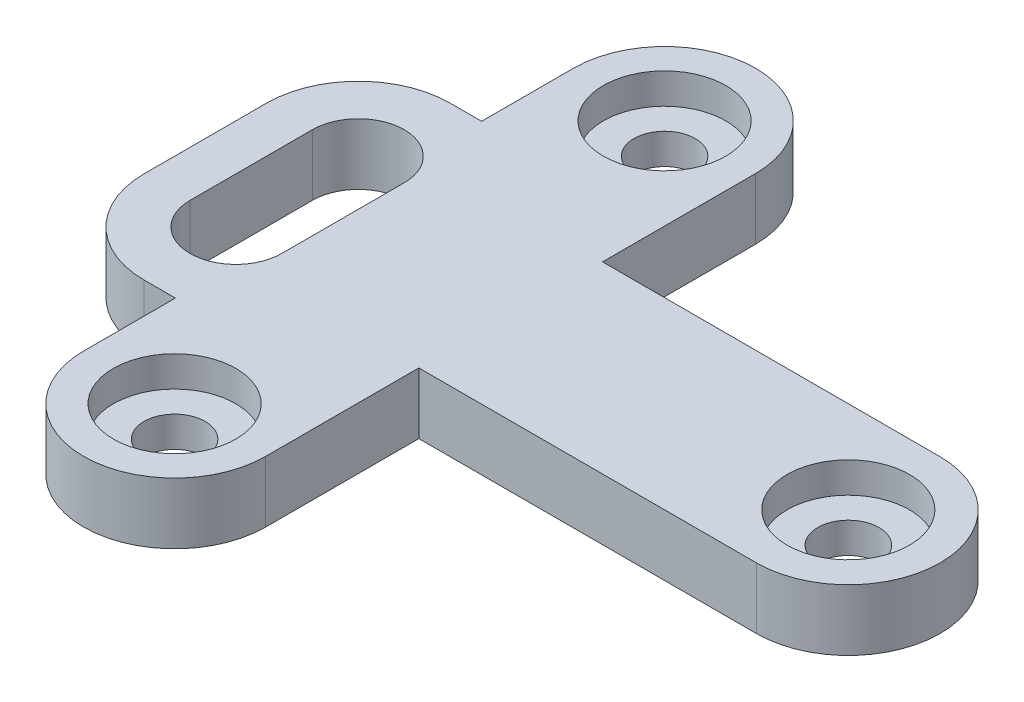
ISO-10303-21;
HEADER;
FILE_DESCRIPTION(('STEP AP214'),'2;1');
FILE_NAME('part.step','',(''),(''),'','','');
FILE_SCHEMA(('AUTOMOTIVE_DESIGN { 1 0 10303 214 1 1 1 1 }'));
ENDSEC;
DATA;
#1=APPLICATION_CONTEXT('core data for automotive mechanical design processes');
#2=APPLICATION_PROTOCOL_DEFINITION('international standard','automotive_design',2000,#1);
#3=PRODUCT_CONTEXT('',#1,'mechanical');
#4=PRODUCT('Part','Part','',(#3));
#5=PRODUCT_RELATED_PRODUCT_CATEGORY('part','',(#4));
#6=PRODUCT_DEFINITION_FORMATION('','',#4);
#7=PRODUCT_DEFINITION_CONTEXT('part definition',#1,'design');
#8=PRODUCT_DEFINITION('design','',#6,#7);
#9=PRODUCT_DEFINITION_SHAPE('','',#8);
#10=(LENGTH_UNIT() NAMED_UNIT(*) SI_UNIT(.MILLI.,.METRE.));
#11=(NAMED_UNIT(*) PLANE_ANGLE_UNIT() SI_UNIT($,.RADIAN.));
#12=(NAMED_UNIT(*) SI_UNIT($,.STERADIAN.) SOLID_ANGLE_UNIT());
#13=UNCERTAINTY_MEASURE_WITH_UNIT(LENGTH_MEASURE(1.E-05),#10,'distance_accuracy_value','');
#14=(GEOMETRIC_REPRESENTATION_CONTEXT(3) GLOBAL_UNCERTAINTY_ASSIGNED_CONTEXT((#13)) GLOBAL_UNIT_ASSIGNED_CONTEXT((#10,
#11,#12)) REPRESENTATION_CONTEXT('',''));
#15=CARTESIAN_POINT('',(0.,0.,0.));
#16=DIRECTION('',(0.,0.,1.));
#17=DIRECTION('',(1.,0.,0.));
#18=AXIS2_PLACEMENT_3D('',#15,#16,#17);
#19=CARTESIAN_POINT('',(0.,10.,-25.));
#20=DIRECTION('',(0.,0.,-1.));
#21=DIRECTION('',(-1.,0.,0.));
#22=AXIS2_PLACEMENT_3D('',#19,#20,#21);
#23=PLANE('',#22);
#24=DIRECTION('',(1.,0.,0.));
#25=VECTOR('',#24,1.);
#26=CARTESIAN_POINT('',(0.,0.,-25.));
#27=LINE('',#26,#25);
#28=CARTESIAN_POINT('',(-31.8487960876977,0.,-25.));
#29=VERTEX_POINT('',#28);
#30=CARTESIAN_POINT('',(-26.7239932822356,0.,-25.));
#31=VERTEX_POINT('',#30);
#32=EDGE_CURVE('E228',#29,#31,#27,.T.);
#33=ORIENTED_EDGE('',*,*,#32,.F.);
#34=DIRECTION('',(0.,-1.,0.));
#35=VECTOR('',#34,1.);
#36=CARTESIAN_POINT('',(-31.8487960876977,10.,-25.));
#37=LINE('',#36,#35);
#38=CARTESIAN_POINT('',(-31.8487960876977,10.,-25.));
#39=VERTEX_POINT('',#38);
#40=EDGE_CURVE('E317',#39,#29,#37,.T.);
#41=ORIENTED_EDGE('',*,*,#40,.F.);
#42=DIRECTION('',(1.,0.,0.));
#43=VECTOR('',#42,1.);
#44=CARTESIAN_POINT('',(0.,10.,-25.));
#45=LINE('',#44,#43);
#46=CARTESIAN_POINT('',(-26.7239932822356,10.,-25.));
#47=VERTEX_POINT('',#46);
#48=EDGE_CURVE('E368',#39,#47,#45,.T.);
#49=ORIENTED_EDGE('',*,*,#48,.T.);
#50=DIRECTION('',(0.,-1.,0.));
#51=VECTOR('',#50,1.);
#52=CARTESIAN_POINT('',(-26.7239932822356,10.,-25.));
#53=LINE('',#52,#51);
#54=EDGE_CURVE('E125',#47,#31,#53,.T.);
#55=ORIENTED_EDGE('',*,*,#54,.T.);
#56=EDGE_LOOP('',(#33,#41,#49,#55));
#57=FACE_BOUND('',#56,.T.);
#58=ADVANCED_FACE('F41',(#57),#23,.T.);
#59=CARTESIAN_POINT('',(-31.8487960876976,10.,-10.));
#60=DIRECTION('',(0.,-1.,0.));
#61=DIRECTION('',(0.,0.,-1.));
#62=AXIS2_PLACEMENT_3D('',#59,#60,#61);
#63=CYLINDRICAL_SURFACE('',#62,15.);
#64=CARTESIAN_POINT('',(-31.8487960876976,0.,-10.));
#65=DIRECTION('',(0.,1.,0.));
#66=DIRECTION('',(0.,0.,1.));
#67=AXIS2_PLACEMENT_3D('',#64,#65,#66);
#68=CIRCLE('',#67,15.);
#69=CARTESIAN_POINT('',(-46.8487960876976,0.,-10.));
#70=VERTEX_POINT('',#69);
#71=EDGE_CURVE('E231',#29,#70,#68,.T.);
#72=ORIENTED_EDGE('',*,*,#71,.T.);
#73=DIRECTION('',(0.,-1.,0.));
#74=VECTOR('',#73,1.);
#75=CARTESIAN_POINT('',(-46.8487960876976,10.,-10.));
#76=LINE('',#75,#74);
#77=CARTESIAN_POINT('',(-46.8487960876976,10.,-10.));
#78=VERTEX_POINT('',#77);
#79=EDGE_CURVE('E313',#78,#70,#76,.T.);
#80=ORIENTED_EDGE('',*,*,#79,.F.);
#81=CARTESIAN_POINT('',(-31.8487960876976,10.,-10.));
#82=DIRECTION('',(0.,1.,0.));
#83=DIRECTION('',(0.,0.,1.));
#84=AXIS2_PLACEMENT_3D('',#81,#82,#83);
#85=CIRCLE('',#84,15.);
#86=EDGE_CURVE('E371',#39,#78,#85,.T.);
#87=ORIENTED_EDGE('',*,*,#86,.F.);
#88=ORIENTED_EDGE('',*,*,#40,.T.);
#89=EDGE_LOOP('',(#72,#80,#87,#88));
#90=FACE_BOUND('',#89,.T.);
#91=ADVANCED_FACE('F464',(#90),#63,.T.);
#92=CARTESIAN_POINT('',(-46.8487960876976,10.,0.));
#93=DIRECTION('',(1.,0.,0.));
#94=DIRECTION('',(0.,0.,-1.));
#95=AXIS2_PLACEMENT_3D('',#92,#93,#94);
#96=PLANE('',#95);
#97=DIRECTION('',(0.,0.,1.));
#98=VECTOR('',#97,1.);
#99=CARTESIAN_POINT('',(-46.8487960876976,0.,0.));
#100=LINE('',#99,#98);
#101=CARTESIAN_POINT('',(-46.8487960876976,0.,10.));
#102=VERTEX_POINT('',#101);
#103=EDGE_CURVE('E235',#70,#102,#100,.T.);
#104=ORIENTED_EDGE('',*,*,#103,.T.);
#105=DIRECTION('',(0.,-1.,0.));
#106=VECTOR('',#105,1.);
#107=CARTESIAN_POINT('',(-46.8487960876976,10.,10.));
#108=LINE('',#107,#106);
#109=CARTESIAN_POINT('',(-46.8487960876976,10.,10.));
#110=VERTEX_POINT('',#109);
#111=EDGE_CURVE('E309',#110,#102,#108,.T.);
#112=ORIENTED_EDGE('',*,*,#111,.F.);
#113=DIRECTION('',(0.,0.,1.));
#114=VECTOR('',#113,1.);
#115=CARTESIAN_POINT('',(-46.8487960876976,10.,0.));
#116=LINE('',#115,#114);
#117=EDGE_CURVE('E375',#78,#110,#116,.T.);
#118=ORIENTED_EDGE('',*,*,#117,.F.);
#119=ORIENTED_EDGE('',*,*,#79,.T.);
#120=EDGE_LOOP('',(#104,#112,#118,#119));
#121=FACE_BOUND('',#120,.T.);
#122=ADVANCED_FACE('F469',(#121),#96,.F.);
#123=CARTESIAN_POINT('',(-31.8487960876976,10.,10.));
#124=DIRECTION('',(0.,-1.,0.));
#125=DIRECTION('',(0.,0.,-1.));
#126=AXIS2_PLACEMENT_3D('',#123,#124,#125);
#127=CYLINDRICAL_SURFACE('',#126,15.);
#128=CARTESIAN_POINT('',(-31.8487960876976,0.,10.));
#129=DIRECTION('',(0.,1.,0.));
#130=DIRECTION('',(0.,0.,1.));
#131=AXIS2_PLACEMENT_3D('',#128,#129,#130);
#132=CIRCLE('',#131,15.);
#133=CARTESIAN_POINT('',(-31.8487960876975,0.,25.));
#134=VERTEX_POINT('',#133);
#135=EDGE_CURVE('E239',#102,#134,#132,.T.);
#136=ORIENTED_EDGE('',*,*,#135,.T.);
#137=DIRECTION('',(0.,-1.,0.));
#138=VECTOR('',#137,1.);
#139=CARTESIAN_POINT('',(-31.8487960876975,10.,25.));
#140=LINE('',#139,#138);
#141=CARTESIAN_POINT('',(-31.8487960876975,10.,25.));
#142=VERTEX_POINT('',#141);
#143=EDGE_CURVE('E305',#142,#134,#140,.T.);
#144=ORIENTED_EDGE('',*,*,#143,.F.);
#145=CARTESIAN_POINT('',(-31.8487960876976,10.,10.));
#146=DIRECTION('',(0.,1.,0.));
#147=DIRECTION('',(0.,0.,1.));
#148=AXIS2_PLACEMENT_3D('',#145,#146,#147);
#149=CIRCLE('',#148,15.);
#150=EDGE_CURVE('E379',#110,#142,#149,.T.);
#151=ORIENTED_EDGE('',*,*,#150,.F.);
#152=ORIENTED_EDGE('',*,*,#111,.T.);
#153=EDGE_LOOP('',(#136,#144,#151,#152));
#154=FACE_BOUND('',#153,.T.);
#155=ADVANCED_FACE('F542',(#154),#127,.T.);
#156=CARTESIAN_POINT('',(0.,10.,25.));
#157=DIRECTION('',(0.,0.,-1.));
#158=DIRECTION('',(-1.,0.,0.));
#159=AXIS2_PLACEMENT_3D('',#156,#157,#158);
#160=PLANE('',#159);
#161=DIRECTION('',(1.,0.,0.));
#162=VECTOR('',#161,1.);
#163=CARTESIAN_POINT('',(0.,0.,25.));
#164=LINE('',#163,#162);
#165=CARTESIAN_POINT('',(-26.7239932822356,0.,25.));
#166=VERTEX_POINT('',#165);
#167=EDGE_CURVE('E243',#134,#166,#164,.T.);
#168=ORIENTED_EDGE('',*,*,#167,.T.);
#169=DIRECTION('',(0.,-1.,0.));
#170=VECTOR('',#169,1.);
#171=CARTESIAN_POINT('',(-26.7239932822356,10.,25.));
#172=LINE('',#171,#170);
#173=CARTESIAN_POINT('',(-26.7239932822356,10.,25.));
#174=VERTEX_POINT('',#173);
#175=EDGE_CURVE('E301',#174,#166,#172,.T.);
#176=ORIENTED_EDGE('',*,*,#175,.F.);
#177=DIRECTION('',(1.,0.,0.));
#178=VECTOR('',#177,1.);
#179=CARTESIAN_POINT('',(0.,10.,25.));
#180=LINE('',#179,#178);
#181=EDGE_CURVE('E383',#142,#174,#180,.T.);
#182=ORIENTED_EDGE('',*,*,#181,.F.);
#183=ORIENTED_EDGE('',*,*,#143,.T.);
#184=EDGE_LOOP('',(#168,#176,#182,#183));
#185=FACE_BOUND('',#184,.T.);
#186=ADVANCED_FACE('F538',(#185),#160,.F.);
#187=CARTESIAN_POINT('',(-26.7239932822356,10.,0.));
#188=DIRECTION('',(1.,0.,0.));
#189=DIRECTION('',(0.,0.,-1.));
#190=AXIS2_PLACEMENT_3D('',#187,#188,#189);
#191=PLANE('',#190);
#192=DIRECTION('',(0.,0.,1.));
#193=VECTOR('',#192,1.);
#194=CARTESIAN_POINT('',(-26.7239932822356,0.,0.));
#195=LINE('',#194,#193);
#196=CARTESIAN_POINT('',(-26.7239932822356,0.,40.));
#197=VERTEX_POINT('',#196);
#198=EDGE_CURVE('E247',#166,#197,#195,.T.);
#199=ORIENTED_EDGE('',*,*,#198,.T.);
#200=DIRECTION('',(0.,-1.,0.));
#201=VECTOR('',#200,1.);
#202=CARTESIAN_POINT('',(-26.7239932822356,10.,40.));
#203=LINE('',#202,#201);
#204=CARTESIAN_POINT('',(-26.7239932822356,10.,40.));
#205=VERTEX_POINT('',#204);
#206=EDGE_CURVE('E298',#205,#197,#203,.T.);
#207=ORIENTED_EDGE('',*,*,#206,.F.);
#208=DIRECTION('',(0.,0.,1.));
#209=VECTOR('',#208,1.);
#210=CARTESIAN_POINT('',(-26.7239932822356,10.,0.));
#211=LINE('',#210,#209);
#212=EDGE_CURVE('E387',#174,#205,#211,.T.);
#213=ORIENTED_EDGE('',*,*,#212,.F.);
#214=ORIENTED_EDGE('',*,*,#175,.T.);
#215=EDGE_LOOP('',(#199,#207,#213,#214));
#216=FACE_BOUND('',#215,.T.);
#217=ADVANCED_FACE('F534',(#216),#191,.F.);
#218=CARTESIAN_POINT('',(-11.8487960876976,10.,40.));
#219=DIRECTION('',(0.,-1.,0.));
#220=DIRECTION('',(0.,0.,-1.));
#221=AXIS2_PLACEMENT_3D('',#218,#219,#220);
#222=CYLINDRICAL_SURFACE('',#221,14.8751971945379);
#223=CARTESIAN_POINT('',(-11.8487960876976,0.,40.));
#224=DIRECTION('',(0.,1.,0.));
#225=DIRECTION('',(0.,0.,1.));
#226=AXIS2_PLACEMENT_3D('',#223,#224,#225);
#227=CIRCLE('',#226,14.8751971945379);
#228=CARTESIAN_POINT('',(3.0264011068403,0.,40.));
#229=VERTEX_POINT('',#228);
#230=EDGE_CURVE('E251',#229,#197,#227,.F.);
#231=ORIENTED_EDGE('',*,*,#230,.F.);
#232=DIRECTION('',(0.,-1.,0.));
#233=VECTOR('',#232,1.);
#234=CARTESIAN_POINT('',(3.0264011068403,10.,40.));
#235=LINE('',#234,#233);
#236=CARTESIAN_POINT('',(3.0264011068403,10.,40.));
#237=VERTEX_POINT('',#236);
#238=EDGE_CURVE('E295',#237,#229,#235,.T.);
#239=ORIENTED_EDGE('',*,*,#238,.F.);
#240=CARTESIAN_POINT('',(-11.8487960876976,10.,40.));
#241=DIRECTION('',(0.,1.,0.));
#242=DIRECTION('',(0.,0.,1.));
#243=AXIS2_PLACEMENT_3D('',#240,#241,#242);
#244=CIRCLE('',#243,14.8751971945379);
#245=EDGE_CURVE('E390',#237,#205,#244,.F.);
#246=ORIENTED_EDGE('',*,*,#245,.T.);
#247=ORIENTED_EDGE('',*,*,#206,.T.);
#248=EDGE_LOOP('',(#231,#239,#246,#247));
#249=FACE_BOUND('',#248,.T.);
#250=ADVANCED_FACE('F530',(#249),#222,.T.);
#251=CARTESIAN_POINT('',(3.0264011068403,10.,0.));
#252=DIRECTION('',(-1.,0.,0.));
#253=DIRECTION('',(0.,0.,1.));
#254=AXIS2_PLACEMENT_3D('',#251,#252,#253);
#255=PLANE('',#254);
#256=DIRECTION('',(0.,0.,-1.));
#257=VECTOR('',#256,1.);
#258=CARTESIAN_POINT('',(3.0264011068403,0.,0.));
#259=LINE('',#258,#257);
#260=CARTESIAN_POINT('',(3.0264011068403,0.,15.));
#261=VERTEX_POINT('',#260);
#262=EDGE_CURVE('E255',#229,#261,#259,.T.);
#263=ORIENTED_EDGE('',*,*,#262,.T.);
#264=DIRECTION('',(0.,-1.,0.));
#265=VECTOR('',#264,1.);
#266=CARTESIAN_POINT('',(3.0264011068403,10.,15.));
#267=LINE('',#266,#265);
#268=CARTESIAN_POINT('',(3.0264011068403,10.,15.));
#269=VERTEX_POINT('',#268);
#270=EDGE_CURVE('E292',#269,#261,#267,.T.);
#271=ORIENTED_EDGE('',*,*,#270,.F.);
#272=DIRECTION('',(0.,0.,-1.));
#273=VECTOR('',#272,1.);
#274=CARTESIAN_POINT('',(3.0264011068403,10.,0.));
#275=LINE('',#274,#273);
#276=EDGE_CURVE('E394',#237,#269,#275,.T.);
#277=ORIENTED_EDGE('',*,*,#276,.F.);
#278=ORIENTED_EDGE('',*,*,#238,.T.);
#279=EDGE_LOOP('',(#263,#271,#277,#278));
#280=FACE_BOUND('',#279,.T.);
#281=ADVANCED_FACE('F526',(#280),#255,.F.);
#282=CARTESIAN_POINT('',(0.,10.,15.));
#283=DIRECTION('',(0.,0.,1.));
#284=DIRECTION('',(1.,0.,0.));
#285=AXIS2_PLACEMENT_3D('',#282,#283,#284);
#286=PLANE('',#285);
#287=DIRECTION('',(-1.,0.,0.));
#288=VECTOR('',#287,1.);
#289=CARTESIAN_POINT('',(0.,0.,15.));
#290=LINE('',#289,#288);
#291=CARTESIAN_POINT('',(58.1512039123024,0.,15.));
#292=VERTEX_POINT('',#291);
#293=EDGE_CURVE('E259',#292,#261,#290,.T.);
#294=ORIENTED_EDGE('',*,*,#293,.F.);
#295=DIRECTION('',(0.,-1.,0.));
#296=VECTOR('',#295,1.);
#297=CARTESIAN_POINT('',(58.1512039123024,10.,15.));
#298=LINE('',#297,#296);
#299=CARTESIAN_POINT('',(58.1512039123024,10.,15.));
#300=VERTEX_POINT('',#299);
#301=EDGE_CURVE('E289',#300,#292,#298,.T.);
#302=ORIENTED_EDGE('',*,*,#301,.F.);
#303=DIRECTION('',(-1.,0.,0.));
#304=VECTOR('',#303,1.);
#305=CARTESIAN_POINT('',(0.,10.,15.));
#306=LINE('',#305,#304);
#307=EDGE_CURVE('E397',#300,#269,#306,.T.);
#308=ORIENTED_EDGE('',*,*,#307,.T.);
#309=ORIENTED_EDGE('',*,*,#270,.T.);
#310=EDGE_LOOP('',(#294,#302,#308,#309));
#311=FACE_BOUND('',#310,.T.);
#312=ADVANCED_FACE('F523',(#311),#286,.T.);
#313=CARTESIAN_POINT('',(58.1512039123024,10.,0.));
#314=DIRECTION('',(0.,-1.,0.));
#315=DIRECTION('',(0.,0.,-1.));
#316=AXIS2_PLACEMENT_3D('',#313,#314,#315);
#317=CYLINDRICAL_SURFACE('',#316,15.);
#318=CARTESIAN_POINT('',(58.1512039123024,0.,0.));
#319=DIRECTION('',(0.,1.,0.));
#320=DIRECTION('',(0.,0.,1.));
#321=AXIS2_PLACEMENT_3D('',#318,#319,#320);
#322=CIRCLE('',#321,15.);
#323=CARTESIAN_POINT('',(58.1512039123024,0.,-15.));
#324=VERTEX_POINT('',#323);
#325=EDGE_CURVE('E263',#292,#324,#322,.T.);
#326=ORIENTED_EDGE('',*,*,#325,.T.);
#327=DIRECTION('',(0.,-1.,0.));
#328=VECTOR('',#327,1.);
#329=CARTESIAN_POINT('',(58.1512039123024,10.,-15.));
#330=LINE('',#329,#328);
#331=CARTESIAN_POINT('',(58.1512039123024,10.,-15.));
#332=VERTEX_POINT('',#331);
#333=EDGE_CURVE('E285',#332,#324,#330,.T.);
#334=ORIENTED_EDGE('',*,*,#333,.F.);
#335=CARTESIAN_POINT('',(58.1512039123024,10.,0.));
#336=DIRECTION('',(0.,1.,0.));
#337=DIRECTION('',(0.,0.,1.));
#338=AXIS2_PLACEMENT_3D('',#335,#336,#337);
#339=CIRCLE('',#338,15.);
#340=EDGE_CURVE('E204',#300,#332,#339,.T.);
#341=ORIENTED_EDGE('',*,*,#340,.F.);
#342=ORIENTED_EDGE('',*,*,#301,.T.);
#343=EDGE_LOOP('',(#326,#334,#341,#342));
#344=FACE_BOUND('',#343,.T.);
#345=ADVANCED_FACE('F405',(#344),#317,.T.);
#346=CARTESIAN_POINT('',(0.,10.,-15.));
#347=DIRECTION('',(0.,0.,1.));
#348=DIRECTION('',(1.,0.,0.));
#349=AXIS2_PLACEMENT_3D('',#346,#347,#348);
#350=PLANE('',#349);
#351=DIRECTION('',(-1.,0.,0.));
#352=VECTOR('',#351,1.);
#353=CARTESIAN_POINT('',(0.,0.,-15.));
#354=LINE('',#353,#352);
#355=CARTESIAN_POINT('',(3.0264011068403,0.,-15.));
#356=VERTEX_POINT('',#355);
#357=EDGE_CURVE('E267',#324,#356,#354,.T.);
#358=ORIENTED_EDGE('',*,*,#357,.T.);
#359=DIRECTION('',(0.,-1.,0.));
#360=VECTOR('',#359,1.);
#361=CARTESIAN_POINT('',(3.0264011068403,10.,-15.));
#362=LINE('',#361,#360);
#363=CARTESIAN_POINT('',(3.0264011068403,10.,-15.));
#364=VERTEX_POINT('',#363);
#365=EDGE_CURVE('E189',#364,#356,#362,.T.);
#366=ORIENTED_EDGE('',*,*,#365,.F.);
#367=DIRECTION('',(-1.,0.,0.));
#368=VECTOR('',#367,1.);
#369=CARTESIAN_POINT('',(0.,10.,-15.));
#370=LINE('',#369,#368);
#371=EDGE_CURVE('E199',#332,#364,#370,.T.);
#372=ORIENTED_EDGE('',*,*,#371,.F.);
#373=ORIENTED_EDGE('',*,*,#333,.T.);
#374=EDGE_LOOP('',(#358,#366,#372,#373));
#375=FACE_BOUND('',#374,.T.);
#376=ADVANCED_FACE('F408',(#375),#350,.F.);
#377=CARTESIAN_POINT('',(3.0264011068403,10.,0.));
#378=DIRECTION('',(1.,0.,0.));
#379=DIRECTION('',(0.,0.,-1.));
#380=AXIS2_PLACEMENT_3D('',#377,#378,#379);
#381=PLANE('',#380);
#382=DIRECTION('',(0.,0.,1.));
#383=VECTOR('',#382,1.);
#384=CARTESIAN_POINT('',(3.0264011068403,0.,0.));
#385=LINE('',#384,#383);
#386=CARTESIAN_POINT('',(3.0264011068403,0.,-40.));
#387=VERTEX_POINT('',#386);
#388=EDGE_CURVE('E185',#387,#356,#385,.T.);
#389=ORIENTED_EDGE('',*,*,#388,.F.);
#390=DIRECTION('',(0.,-1.,0.));
#391=VECTOR('',#390,1.);
#392=CARTESIAN_POINT('',(3.0264011068403,10.,-40.));
#393=LINE('',#392,#391);
#394=CARTESIAN_POINT('',(3.0264011068403,10.,-40.));
#395=VERTEX_POINT('',#394);
#396=EDGE_CURVE('E179',#395,#387,#393,.T.);
#397=ORIENTED_EDGE('',*,*,#396,.F.);
#398=DIRECTION('',(0.,0.,1.));
#399=VECTOR('',#398,1.);
#400=CARTESIAN_POINT('',(3.0264011068403,10.,0.));
#401=LINE('',#400,#399);
#402=EDGE_CURVE('E183',#395,#364,#401,.T.);
#403=ORIENTED_EDGE('',*,*,#402,.T.);
#404=ORIENTED_EDGE('',*,*,#365,.T.);
#405=EDGE_LOOP('',(#389,#397,#403,#404));
#406=FACE_BOUND('',#405,.T.);
#407=ADVANCED_FACE('F181',(#406),#381,.T.);
#408=CARTESIAN_POINT('',(-11.8487960876976,10.,-40.));
#409=DIRECTION('',(0.,-1.,0.));
#410=DIRECTION('',(0.,0.,-1.));
#411=AXIS2_PLACEMENT_3D('',#408,#409,#410);
#412=CYLINDRICAL_SURFACE('',#411,14.8751971945379);
#413=CARTESIAN_POINT('',(-11.8487960876976,0.,-40.));
#414=DIRECTION('',(0.,1.,0.));
#415=DIRECTION('',(0.,0.,1.));
#416=AXIS2_PLACEMENT_3D('',#413,#414,#415);
#417=CIRCLE('',#416,14.8751971945379);
#418=CARTESIAN_POINT('',(-26.7239932822356,0.,-40.));
#419=VERTEX_POINT('',#418);
#420=EDGE_CURVE('E273',#387,#419,#417,.T.);
#421=ORIENTED_EDGE('',*,*,#420,.T.);
#422=DIRECTION('',(0.,-1.,0.));
#423=VECTOR('',#422,1.);
#424=CARTESIAN_POINT('',(-26.7239932822356,10.,-40.));
#425=LINE('',#424,#423);
#426=CARTESIAN_POINT('',(-26.7239932822356,10.,-40.));
#427=VERTEX_POINT('',#426);
#428=EDGE_CURVE('E190',#427,#419,#425,.T.);
#429=ORIENTED_EDGE('',*,*,#428,.F.);
#430=CARTESIAN_POINT('',(-11.8487960876976,10.,-40.));
#431=DIRECTION('',(0.,1.,0.));
#432=DIRECTION('',(0.,0.,1.));
#433=AXIS2_PLACEMENT_3D('',#430,#431,#432);
#434=CIRCLE('',#433,14.8751971945379);
#435=EDGE_CURVE('E193',#395,#427,#434,.T.);
#436=ORIENTED_EDGE('',*,*,#435,.F.);
#437=ORIENTED_EDGE('',*,*,#396,.T.);
#438=EDGE_LOOP('',(#421,#429,#436,#437));
#439=FACE_BOUND('',#438,.T.);
#440=ADVANCED_FACE('F194',(#439),#412,.T.);
#441=CARTESIAN_POINT('',(-31.8487960876976,10.,10.));
#442=DIRECTION('',(0.,-1.,0.));
#443=DIRECTION('',(0.,0.,-1.));
#444=AXIS2_PLACEMENT_3D('',#441,#442,#443);
#445=CYLINDRICAL_SURFACE('',#444,7.5);
#446=CARTESIAN_POINT('',(-31.8487960876976,0.,10.));
#447=DIRECTION('',(0.,1.,0.));
#448=DIRECTION('',(0.,0.,1.));
#449=AXIS2_PLACEMENT_3D('',#446,#447,#448);
#450=CIRCLE('',#449,7.5);
#451=CARTESIAN_POINT('',(-39.3487960876976,0.,10.));
#452=VERTEX_POINT('',#451);
#453=CARTESIAN_POINT('',(-24.3487960876976,0.,10.));
#454=VERTEX_POINT('',#453);
#455=EDGE_CURVE('E211',#452,#454,#450,.T.);
#456=ORIENTED_EDGE('',*,*,#455,.F.);
#457=DIRECTION('',(0.,-1.,0.));
#458=VECTOR('',#457,1.);
#459=CARTESIAN_POINT('',(-39.3487960876976,10.,10.));
#460=LINE('',#459,#458);
#461=CARTESIAN_POINT('',(-39.3487960876976,10.,10.));
#462=VERTEX_POINT('',#461);
#463=EDGE_CURVE('E132',#462,#452,#460,.T.);
#464=ORIENTED_EDGE('',*,*,#463,.F.);
#465=CARTESIAN_POINT('',(-31.8487960876976,10.,10.));
#466=DIRECTION('',(0.,1.,0.));
#467=DIRECTION('',(0.,0.,1.));
#468=AXIS2_PLACEMENT_3D('',#465,#466,#467);
#469=CIRCLE('',#468,7.5);
#470=CARTESIAN_POINT('',(-24.3487960876976,10.,10.));
#471=VERTEX_POINT('',#470);
#472=EDGE_CURVE('E349',#462,#471,#469,.T.);
#473=ORIENTED_EDGE('',*,*,#472,.T.);
#474=DIRECTION('',(0.,-1.,0.));
#475=VECTOR('',#474,1.);
#476=CARTESIAN_POINT('',(-24.3487960876976,10.,10.));
#477=LINE('',#476,#475);
#478=EDGE_CURVE('E210',#471,#454,#477,.T.);
#479=ORIENTED_EDGE('',*,*,#478,.T.);
#480=EDGE_LOOP('',(#456,#464,#473,#479));
#481=FACE_BOUND('',#480,.T.);
#482=ADVANCED_FACE('F485',(#481),#445,.F.);
#483=CARTESIAN_POINT('',(-39.3487960876976,10.,0.));
#484=DIRECTION('',(1.,0.,0.));
#485=DIRECTION('',(0.,0.,-1.));
#486=AXIS2_PLACEMENT_3D('',#483,#484,#485);
#487=PLANE('',#486);
#488=DIRECTION('',(0.,0.,1.));
#489=VECTOR('',#488,1.);
#490=CARTESIAN_POINT('',(-39.3487960876976,0.,0.));
#491=LINE('',#490,#489);
#492=CARTESIAN_POINT('',(-39.3487960876976,0.,-10.));
#493=VERTEX_POINT('',#492);
#494=EDGE_CURVE('E215',#493,#452,#491,.T.);
#495=ORIENTED_EDGE('',*,*,#494,.F.);
#496=DIRECTION('',(0.,-1.,0.));
#497=VECTOR('',#496,1.);
#498=CARTESIAN_POINT('',(-39.3487960876976,10.,-10.));
#499=LINE('',#498,#497);
#500=CARTESIAN_POINT('',(-39.3487960876976,10.,-10.));
#501=VERTEX_POINT('',#500);
#502=EDGE_CURVE('E325',#501,#493,#499,.T.);
#503=ORIENTED_EDGE('',*,*,#502,.F.);
#504=DIRECTION('',(0.,0.,1.));
#505=VECTOR('',#504,1.);
#506=CARTESIAN_POINT('',(-39.3487960876976,10.,0.));
#507=LINE('',#506,#505);
#508=EDGE_CURVE('E357',#501,#462,#507,.T.);
#509=ORIENTED_EDGE('',*,*,#508,.T.);
#510=ORIENTED_EDGE('',*,*,#463,.T.);
#511=EDGE_LOOP('',(#495,#503,#509,#510));
#512=FACE_BOUND('',#511,.T.);
#513=ADVANCED_FACE('F481',(#512),#487,.T.);
#514=CARTESIAN_POINT('',(-31.8487960876976,10.,-10.));
#515=DIRECTION('',(0.,-1.,0.));
#516=DIRECTION('',(0.,0.,-1.));
#517=AXIS2_PLACEMENT_3D('',#514,#515,#516);
#518=CYLINDRICAL_SURFACE('',#517,7.5);
#519=CARTESIAN_POINT('',(-31.8487960876976,0.,-10.));
#520=DIRECTION('',(0.,1.,0.));
#521=DIRECTION('',(0.,0.,1.));
#522=AXIS2_PLACEMENT_3D('',#519,#520,#521);
#523=CIRCLE('',#522,7.5);
#524=CARTESIAN_POINT('',(-24.3487960876976,0.,-10.));
#525=VERTEX_POINT('',#524);
#526=EDGE_CURVE('E220',#525,#493,#523,.T.);
#527=ORIENTED_EDGE('',*,*,#526,.F.);
#528=DIRECTION('',(0.,-1.,0.));
#529=VECTOR('',#528,1.);
#530=CARTESIAN_POINT('',(-24.3487960876976,10.,-10.));
#531=LINE('',#530,#529);
#532=CARTESIAN_POINT('',(-24.3487960876976,10.,-10.));
#533=VERTEX_POINT('',#532);
#534=EDGE_CURVE('E322',#533,#525,#531,.T.);
#535=ORIENTED_EDGE('',*,*,#534,.F.);
#536=CARTESIAN_POINT('',(-31.8487960876976,10.,-10.));
#537=DIRECTION('',(0.,1.,0.));
#538=DIRECTION('',(0.,0.,1.));
#539=AXIS2_PLACEMENT_3D('',#536,#537,#538);
#540=CIRCLE('',#539,7.5);
#541=EDGE_CURVE('E361',#533,#501,#540,.T.);
#542=ORIENTED_EDGE('',*,*,#541,.T.);
#543=ORIENTED_EDGE('',*,*,#502,.T.);
#544=EDGE_LOOP('',(#527,#535,#542,#543));
#545=FACE_BOUND('',#544,.T.);
#546=ADVANCED_FACE('F477',(#545),#518,.F.);
#547=CARTESIAN_POINT('',(-24.3487960876976,10.,0.));
#548=DIRECTION('',(1.,0.,0.));
#549=DIRECTION('',(0.,0.,-1.));
#550=AXIS2_PLACEMENT_3D('',#547,#548,#549);
#551=PLANE('',#550);
#552=DIRECTION('',(0.,0.,1.));
#553=VECTOR('',#552,1.);
#554=CARTESIAN_POINT('',(-24.3487960876976,0.,0.));
#555=LINE('',#554,#553);
#556=EDGE_CURVE('E224',#525,#454,#555,.T.);
#557=ORIENTED_EDGE('',*,*,#556,.T.);
#558=ORIENTED_EDGE('',*,*,#478,.F.);
#559=DIRECTION('',(0.,0.,1.));
#560=VECTOR('',#559,1.);
#561=CARTESIAN_POINT('',(-24.3487960876976,10.,0.));
#562=LINE('',#561,#560);
#563=EDGE_CURVE('E365',#533,#471,#562,.T.);
#564=ORIENTED_EDGE('',*,*,#563,.F.);
#565=ORIENTED_EDGE('',*,*,#534,.T.);
#566=EDGE_LOOP('',(#557,#558,#564,#565));
#567=FACE_BOUND('',#566,.T.);
#568=ADVANCED_FACE('F474',(#567),#551,.F.);
#569=CARTESIAN_POINT('',(58.1512039123024,10.,0.));
#570=DIRECTION('',(0.,-1.,0.));
#571=DIRECTION('',(0.,0.,-1.));
#572=AXIS2_PLACEMENT_3D('',#569,#570,#571);
#573=CYLINDRICAL_SURFACE('',#572,10.);
#574=CARTESIAN_POINT('',(58.1512039123024,5.,0.));
#575=DIRECTION('',(0.,1.,0.));
#576=DIRECTION('',(0.,0.,1.));
#577=AXIS2_PLACEMENT_3D('',#574,#575,#576);
#578=CIRCLE('',#577,10.);
#579=CARTESIAN_POINT('',(58.1512039123024,5.,10.));
#580=VERTEX_POINT('',#579);
#581=EDGE_CURVE('E11',#580,#580,#578,.T.);
#582=ORIENTED_EDGE('',*,*,#581,.F.);
#583=EDGE_LOOP('',(#582));
#584=FACE_BOUND('',#583,.T.);
#585=CARTESIAN_POINT('',(58.1512039123024,10.,0.));
#586=DIRECTION('',(0.,1.,0.));
#587=DIRECTION('',(0.,0.,1.));
#588=AXIS2_PLACEMENT_3D('',#585,#586,#587);
#589=CIRCLE('',#588,10.);
#590=CARTESIAN_POINT('',(58.1512039123024,10.,10.));
#591=VERTEX_POINT('',#590);
#592=EDGE_CURVE('E344',#591,#591,#589,.T.);
#593=ORIENTED_EDGE('',*,*,#592,.T.);
#594=EDGE_LOOP('',(#593));
#595=FACE_BOUND('',#594,.T.);
#596=ADVANCED_FACE('F338',(#584,#595),#573,.F.);
#597=CARTESIAN_POINT('',(-11.8487960876976,10.,-40.));
#598=DIRECTION('',(0.,-1.,0.));
#599=DIRECTION('',(0.,0.,-1.));
#600=AXIS2_PLACEMENT_3D('',#597,#598,#599);
#601=CYLINDRICAL_SURFACE('',#600,10.);
#602=CARTESIAN_POINT('',(-11.8487960876976,5.,-40.));
#603=DIRECTION('',(0.,1.,0.));
#604=DIRECTION('',(0.,0.,1.));
#605=AXIS2_PLACEMENT_3D('',#602,#603,#604);
#606=CIRCLE('',#605,10.);
#607=CARTESIAN_POINT('',(-11.8487960876976,5.,-30.));
#608=VERTEX_POINT('',#607);
#609=EDGE_CURVE('E51',#608,#608,#606,.T.);
#610=ORIENTED_EDGE('',*,*,#609,.F.);
#611=EDGE_LOOP('',(#610));
#612=FACE_BOUND('',#611,.T.);
#613=CARTESIAN_POINT('',(-11.8487960876976,10.,-40.));
#614=DIRECTION('',(0.,1.,0.));
#615=DIRECTION('',(0.,0.,1.));
#616=AXIS2_PLACEMENT_3D('',#613,#614,#615);
#617=CIRCLE('',#616,10.);
#618=CARTESIAN_POINT('',(-11.8487960876976,10.,-30.));
#619=VERTEX_POINT('',#618);
#620=EDGE_CURVE('E341',#619,#619,#617,.T.);
#621=ORIENTED_EDGE('',*,*,#620,.T.);
#622=EDGE_LOOP('',(#621));
#623=FACE_BOUND('',#622,.T.);
#624=ADVANCED_FACE('F335',(#612,#623),#601,.F.);
#625=CARTESIAN_POINT('',(-11.8487960876976,10.,40.));
#626=DIRECTION('',(0.,-1.,0.));
#627=DIRECTION('',(0.,0.,-1.));
#628=AXIS2_PLACEMENT_3D('',#625,#626,#627);
#629=CYLINDRICAL_SURFACE('',#628,10.);
#630=CARTESIAN_POINT('',(-11.8487960876976,5.,40.));
#631=DIRECTION('',(0.,1.,0.));
#632=DIRECTION('',(0.,0.,1.));
#633=AXIS2_PLACEMENT_3D('',#630,#631,#632);
#634=CIRCLE('',#633,10.);
#635=CARTESIAN_POINT('',(-11.8487960876976,5.,50.));
#636=VERTEX_POINT('',#635);
#637=EDGE_CURVE('E435',#636,#636,#634,.F.);
#638=ORIENTED_EDGE('',*,*,#637,.T.);
#639=EDGE_LOOP('',(#638));
#640=FACE_BOUND('',#639,.T.);
#641=CARTESIAN_POINT('',(-11.8487960876976,10.,40.));
#642=DIRECTION('',(0.,1.,0.));
#643=DIRECTION('',(0.,0.,1.));
#644=AXIS2_PLACEMENT_3D('',#641,#642,#643);
#645=CIRCLE('',#644,10.);
#646=CARTESIAN_POINT('',(-11.8487960876976,10.,50.));
#647=VERTEX_POINT('',#646);
#648=EDGE_CURVE('E278',#647,#647,#645,.F.);
#649=ORIENTED_EDGE('',*,*,#648,.F.);
#650=EDGE_LOOP('',(#649));
#651=FACE_BOUND('',#650,.T.);
#652=ADVANCED_FACE('F43',(#640,#651),#629,.F.);
#653=CARTESIAN_POINT('',(-26.7239932822356,10.,0.));
#654=DIRECTION('',(1.,0.,0.));
#655=DIRECTION('',(0.,0.,-1.));
#656=AXIS2_PLACEMENT_3D('',#653,#654,#655);
#657=PLANE('',#656);
#658=DIRECTION('',(0.,0.,1.));
#659=VECTOR('',#658,1.);
#660=CARTESIAN_POINT('',(-26.7239932822356,0.,0.));
#661=LINE('',#660,#659);
#662=EDGE_CURVE('E118',#419,#31,#661,.T.);
#663=ORIENTED_EDGE('',*,*,#662,.T.);
#664=ORIENTED_EDGE('',*,*,#54,.F.);
#665=DIRECTION('',(0.,0.,1.));
#666=VECTOR('',#665,1.);
#667=CARTESIAN_POINT('',(-26.7239932822356,10.,0.));
#668=LINE('',#667,#666);
#669=EDGE_CURVE('E59',#427,#47,#668,.T.);
#670=ORIENTED_EDGE('',*,*,#669,.F.);
#671=ORIENTED_EDGE('',*,*,#428,.T.);
#672=EDGE_LOOP('',(#663,#664,#670,#671));
#673=FACE_BOUND('',#672,.T.);
#674=ADVANCED_FACE('F499',(#673),#657,.F.);
#675=CARTESIAN_POINT('',(0.,10.,0.));
#676=DIRECTION('',(0.,1.,0.));
#677=DIRECTION('',(0.,0.,1.));
#678=AXIS2_PLACEMENT_3D('',#675,#676,#677);
#679=PLANE('',#678);
#680=ORIENTED_EDGE('',*,*,#648,.T.);
#681=EDGE_LOOP('',(#680));
#682=FACE_BOUND('',#681,.T.);
#683=ORIENTED_EDGE('',*,*,#620,.F.);
#684=EDGE_LOOP('',(#683));
#685=FACE_BOUND('',#684,.T.);
#686=ORIENTED_EDGE('',*,*,#592,.F.);
#687=EDGE_LOOP('',(#686));
#688=FACE_BOUND('',#687,.T.);
#689=ORIENTED_EDGE('',*,*,#472,.F.);
#690=ORIENTED_EDGE('',*,*,#508,.F.);
#691=ORIENTED_EDGE('',*,*,#541,.F.);
#692=ORIENTED_EDGE('',*,*,#563,.T.);
#693=EDGE_LOOP('',(#689,#690,#691,#692));
#694=FACE_BOUND('',#693,.T.);
#695=ORIENTED_EDGE('',*,*,#48,.F.);
#696=ORIENTED_EDGE('',*,*,#86,.T.);
#697=ORIENTED_EDGE('',*,*,#117,.T.);
#698=ORIENTED_EDGE('',*,*,#150,.T.);
#699=ORIENTED_EDGE('',*,*,#181,.T.);
#700=ORIENTED_EDGE('',*,*,#212,.T.);
#701=ORIENTED_EDGE('',*,*,#245,.F.);
#702=ORIENTED_EDGE('',*,*,#276,.T.);
#703=ORIENTED_EDGE('',*,*,#307,.F.);
#704=ORIENTED_EDGE('',*,*,#340,.T.);
#705=ORIENTED_EDGE('',*,*,#371,.T.);
#706=ORIENTED_EDGE('',*,*,#402,.F.);
#707=ORIENTED_EDGE('',*,*,#435,.T.);
#708=ORIENTED_EDGE('',*,*,#669,.T.);
#709=EDGE_LOOP('',(#695,#696,#697,#698,#699,#700,#701,#702,#703,#704,#705,#706,#707,#708));
#710=FACE_BOUND('',#709,.T.);
#711=ADVANCED_FACE('F197',(#682,#685,#688,#694,#710),#679,.T.);
#712=CARTESIAN_POINT('',(0.,0.,0.));
#713=DIRECTION('',(0.,1.,0.));
#714=DIRECTION('',(0.,0.,1.));
#715=AXIS2_PLACEMENT_3D('',#712,#713,#714);
#716=PLANE('',#715);
#717=ORIENTED_EDGE('',*,*,#455,.T.);
#718=ORIENTED_EDGE('',*,*,#556,.F.);
#719=ORIENTED_EDGE('',*,*,#526,.T.);
#720=ORIENTED_EDGE('',*,*,#494,.T.);
#721=EDGE_LOOP('',(#717,#718,#719,#720));
#722=FACE_BOUND('',#721,.T.);
#723=ORIENTED_EDGE('',*,*,#32,.T.);
#724=ORIENTED_EDGE('',*,*,#662,.F.);
#725=ORIENTED_EDGE('',*,*,#420,.F.);
#726=ORIENTED_EDGE('',*,*,#388,.T.);
#727=ORIENTED_EDGE('',*,*,#357,.F.);
#728=ORIENTED_EDGE('',*,*,#325,.F.);
#729=ORIENTED_EDGE('',*,*,#293,.T.);
#730=ORIENTED_EDGE('',*,*,#262,.F.);
#731=ORIENTED_EDGE('',*,*,#230,.T.);
#732=ORIENTED_EDGE('',*,*,#198,.F.);
#733=ORIENTED_EDGE('',*,*,#167,.F.);
#734=ORIENTED_EDGE('',*,*,#135,.F.);
#735=ORIENTED_EDGE('',*,*,#103,.F.);
#736=ORIENTED_EDGE('',*,*,#71,.F.);
#737=EDGE_LOOP('',(#723,#724,#725,#726,#727,#728,#729,#730,#731,#732,#733,#734,#735,#736));
#738=FACE_BOUND('',#737,.T.);
#739=CARTESIAN_POINT('',(-11.8487960876976,0.,-40.));
#740=DIRECTION('',(0.,1.,0.));
#741=DIRECTION('',(0.,0.,1.));
#742=AXIS2_PLACEMENT_3D('',#739,#740,#741);
#743=CIRCLE('',#742,5.);
#744=CARTESIAN_POINT('',(-11.8487960876976,0.,-35.));
#745=VERTEX_POINT('',#744);
#746=EDGE_CURVE('E419',#745,#745,#743,.T.);
#747=ORIENTED_EDGE('',*,*,#746,.T.);
#748=EDGE_LOOP('',(#747));
#749=FACE_BOUND('',#748,.T.);
#750=CARTESIAN_POINT('',(-11.8487960876976,0.,40.));
#751=DIRECTION('',(0.,1.,0.));
#752=DIRECTION('',(0.,0.,1.));
#753=AXIS2_PLACEMENT_3D('',#750,#751,#752);
#754=CIRCLE('',#753,5.);
#755=CARTESIAN_POINT('',(-11.8487960876976,0.,45.));
#756=VERTEX_POINT('',#755);
#757=EDGE_CURVE('E423',#756,#756,#754,.F.);
#758=ORIENTED_EDGE('',*,*,#757,.F.);
#759=EDGE_LOOP('',(#758));
#760=FACE_BOUND('',#759,.T.);
#761=CARTESIAN_POINT('',(58.1512039123024,0.,0.));
#762=DIRECTION('',(0.,1.,0.));
#763=DIRECTION('',(0.,0.,1.));
#764=AXIS2_PLACEMENT_3D('',#761,#762,#763);
#765=CIRCLE('',#764,5.);
#766=CARTESIAN_POINT('',(58.1512039123024,0.,5.));
#767=VERTEX_POINT('',#766);
#768=EDGE_CURVE('E426',#767,#767,#765,.T.);
#769=ORIENTED_EDGE('',*,*,#768,.T.);
#770=EDGE_LOOP('',(#769));
#771=FACE_BOUND('',#770,.T.);
#772=ADVANCED_FACE('F409',(#722,#738,#749,#760,#771),#716,.F.);
#773=CARTESIAN_POINT('',(-11.8487960876976,5.,-40.));
#774=DIRECTION('',(0.,-1.,0.));
#775=DIRECTION('',(0.,0.,-1.));
#776=AXIS2_PLACEMENT_3D('',#773,#774,#775);
#777=CYLINDRICAL_SURFACE('',#776,5.);
#778=CARTESIAN_POINT('',(-11.8487960876976,5.,-40.));
#779=DIRECTION('',(0.,1.,0.));
#780=DIRECTION('',(0.,0.,1.));
#781=AXIS2_PLACEMENT_3D('',#778,#779,#780);
#782=CIRCLE('',#781,5.);
#783=CARTESIAN_POINT('',(-11.8487960876976,5.,-35.));
#784=VERTEX_POINT('',#783);
#785=EDGE_CURVE('E216',#784,#784,#782,.T.);
#786=ORIENTED_EDGE('',*,*,#785,.T.);
#787=EDGE_LOOP('',(#786));
#788=FACE_BOUND('',#787,.T.);
#789=ORIENTED_EDGE('',*,*,#746,.F.);
#790=EDGE_LOOP('',(#789));
#791=FACE_BOUND('',#790,.T.);
#792=ADVANCED_FACE('F413',(#788,#791),#777,.F.);
#793=CARTESIAN_POINT('',(0.,5.,0.));
#794=DIRECTION('',(0.,1.,0.));
#795=DIRECTION('',(0.,0.,1.));
#796=AXIS2_PLACEMENT_3D('',#793,#794,#795);
#797=PLANE('',#796);
#798=ORIENTED_EDGE('',*,*,#785,.F.);
#799=EDGE_LOOP('',(#798));
#800=FACE_BOUND('',#799,.T.);
#801=ORIENTED_EDGE('',*,*,#609,.T.);
#802=EDGE_LOOP('',(#801));
#803=FACE_BOUND('',#802,.T.);
#804=ADVANCED_FACE('F333',(#800,#803),#797,.T.);
#805=CARTESIAN_POINT('',(-11.8487960876976,5.,40.));
#806=DIRECTION('',(0.,-1.,0.));
#807=DIRECTION('',(0.,0.,-1.));
#808=AXIS2_PLACEMENT_3D('',#805,#806,#807);
#809=CYLINDRICAL_SURFACE('',#808,5.);
#810=CARTESIAN_POINT('',(-11.8487960876976,5.,40.));
#811=DIRECTION('',(0.,1.,0.));
#812=DIRECTION('',(0.,0.,1.));
#813=AXIS2_PLACEMENT_3D('',#810,#811,#812);
#814=CIRCLE('',#813,5.);
#815=CARTESIAN_POINT('',(-11.8487960876976,5.,45.));
#816=VERTEX_POINT('',#815);
#817=EDGE_CURVE('E439',#816,#816,#814,.F.);
#818=ORIENTED_EDGE('',*,*,#817,.F.);
#819=EDGE_LOOP('',(#818));
#820=FACE_BOUND('',#819,.T.);
#821=ORIENTED_EDGE('',*,*,#757,.T.);
#822=EDGE_LOOP('',(#821));
#823=FACE_BOUND('',#822,.T.);
#824=ADVANCED_FACE('F453',(#820,#823),#809,.F.);
#825=CARTESIAN_POINT('',(0.,5.,0.));
#826=DIRECTION('',(0.,1.,0.));
#827=DIRECTION('',(0.,0.,1.));
#828=AXIS2_PLACEMENT_3D('',#825,#826,#827);
#829=PLANE('',#828);
#830=ORIENTED_EDGE('',*,*,#637,.F.);
#831=EDGE_LOOP('',(#830));
#832=FACE_BOUND('',#831,.T.);
#833=ORIENTED_EDGE('',*,*,#817,.T.);
#834=EDGE_LOOP('',(#833));
#835=FACE_BOUND('',#834,.T.);
#836=ADVANCED_FACE('F459',(#832,#835),#829,.T.);
#837=CARTESIAN_POINT('',(58.1512039123024,5.,0.));
#838=DIRECTION('',(0.,-1.,0.));
#839=DIRECTION('',(0.,0.,-1.));
#840=AXIS2_PLACEMENT_3D('',#837,#838,#839);
#841=CYLINDRICAL_SURFACE('',#840,5.);
#842=CARTESIAN_POINT('',(58.1512039123024,5.,0.));
#843=DIRECTION('',(0.,1.,0.));
#844=DIRECTION('',(0.,0.,1.));
#845=AXIS2_PLACEMENT_3D('',#842,#843,#844);
#846=CIRCLE('',#845,5.);
#847=CARTESIAN_POINT('',(58.1512039123024,5.,5.));
#848=VERTEX_POINT('',#847);
#849=EDGE_CURVE('E429',#848,#848,#846,.T.);
#850=ORIENTED_EDGE('',*,*,#849,.T.);
#851=EDGE_LOOP('',(#850));
#852=FACE_BOUND('',#851,.T.);
#853=ORIENTED_EDGE('',*,*,#768,.F.);
#854=EDGE_LOOP('',(#853));
#855=FACE_BOUND('',#854,.T.);
#856=ADVANCED_FACE('F681',(#852,#855),#841,.F.);
#857=CARTESIAN_POINT('',(0.,5.,0.));
#858=DIRECTION('',(0.,1.,0.));
#859=DIRECTION('',(0.,0.,1.));
#860=AXIS2_PLACEMENT_3D('',#857,#858,#859);
#861=PLANE('',#860);
#862=ORIENTED_EDGE('',*,*,#849,.F.);
#863=EDGE_LOOP('',(#862));
#864=FACE_BOUND('',#863,.T.);
#865=ORIENTED_EDGE('',*,*,#581,.T.);
#866=EDGE_LOOP('',(#865));
#867=FACE_BOUND('',#866,.T.);
#868=ADVANCED_FACE('F691',(#864,#867),#861,.T.);
#869=CLOSED_SHELL('',(#58,#91,#122,#155,#186,#217,#250,#281,#312,#345,#376,#407,#440,#482,#513,
#546,#568,#596,#624,#652,#674,#711,#772,#792,#804,#824,#836,#856,#868));
#870=MANIFOLD_SOLID_BREP('B2',#869);
#871=ADVANCED_BREP_SHAPE_REPRESENTATION('',(#18,#870),#14);
#872=SHAPE_DEFINITION_REPRESENTATION(#9,#871);
ENDSEC;
END-ISO-10303-21;
